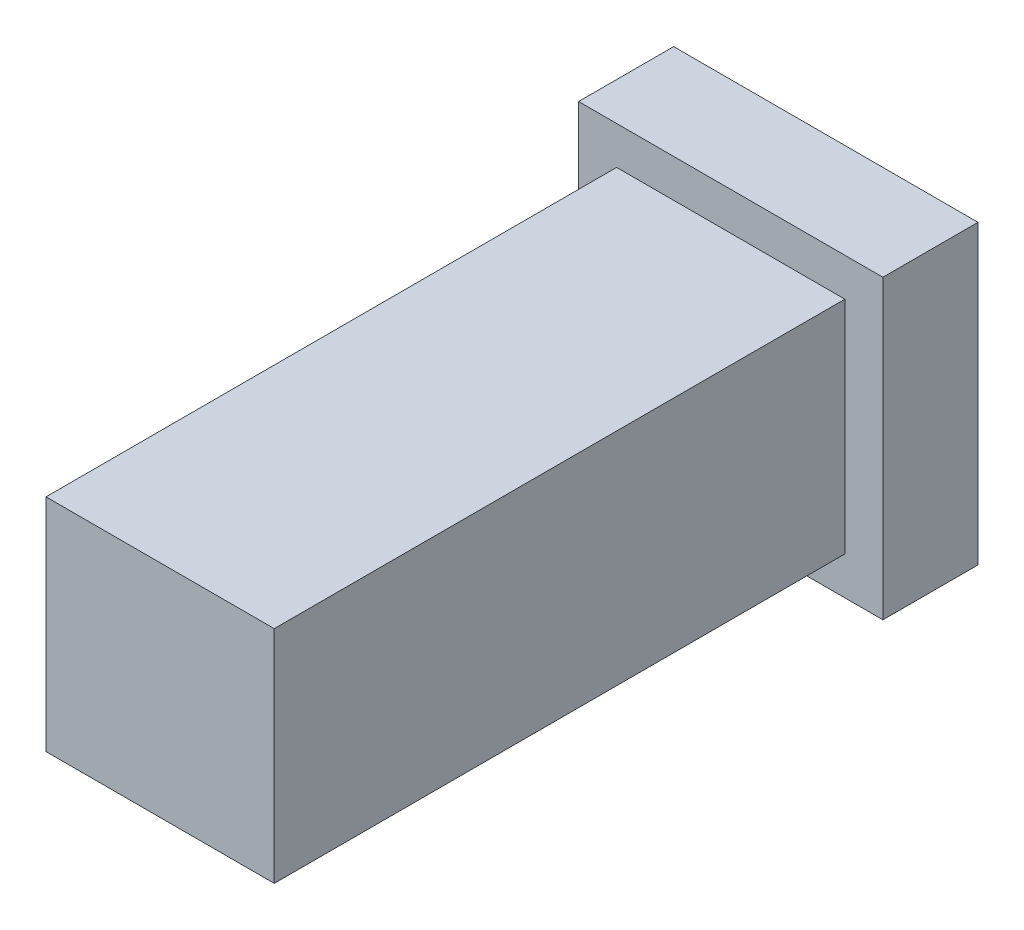
ISO-10303-21;
HEADER;
FILE_DESCRIPTION(('STEP AP214'),'2;1');
FILE_NAME('part.step','',(''),(''),'','','');
FILE_SCHEMA(('AUTOMOTIVE_DESIGN { 1 0 10303 214 1 1 1 1 }'));
ENDSEC;
DATA;
#1=APPLICATION_CONTEXT('core data for automotive mechanical design processes');
#2=APPLICATION_PROTOCOL_DEFINITION('international standard','automotive_design',2000,#1);
#3=PRODUCT_CONTEXT('',#1,'mechanical');
#4=PRODUCT('Part','Part','',(#3));
#5=PRODUCT_RELATED_PRODUCT_CATEGORY('part','',(#4));
#6=PRODUCT_DEFINITION_FORMATION('','',#4);
#7=PRODUCT_DEFINITION_CONTEXT('part definition',#1,'design');
#8=PRODUCT_DEFINITION('design','',#6,#7);
#9=PRODUCT_DEFINITION_SHAPE('','',#8);
#10=(LENGTH_UNIT() NAMED_UNIT(*) SI_UNIT(.MILLI.,.METRE.));
#11=(NAMED_UNIT(*) PLANE_ANGLE_UNIT() SI_UNIT($,.RADIAN.));
#12=(NAMED_UNIT(*) SI_UNIT($,.STERADIAN.) SOLID_ANGLE_UNIT());
#13=UNCERTAINTY_MEASURE_WITH_UNIT(LENGTH_MEASURE(1.E-05),#10,'distance_accuracy_value','');
#14=(GEOMETRIC_REPRESENTATION_CONTEXT(3) GLOBAL_UNCERTAINTY_ASSIGNED_CONTEXT((#13)) GLOBAL_UNIT_ASSIGNED_CONTEXT((#10,
#11,#12)) REPRESENTATION_CONTEXT('',''));
#15=CARTESIAN_POINT('',(0.,0.,0.));
#16=DIRECTION('',(0.,0.,1.));
#17=DIRECTION('',(1.,0.,0.));
#18=AXIS2_PLACEMENT_3D('',#15,#16,#17);
#19=CARTESIAN_POINT('',(3.,2.9,15.));
#20=DIRECTION('',(-1.,0.,0.));
#21=DIRECTION('',(0.,-1.,0.));
#22=AXIS2_PLACEMENT_3D('',#19,#20,#21);
#23=PLANE('',#22);
#24=DIRECTION('',(0.,1.,0.));
#25=VECTOR('',#24,1.);
#26=CARTESIAN_POINT('',(3.,2.9,0.));
#27=LINE('',#26,#25);
#28=CARTESIAN_POINT('',(3.,-2.9,0.));
#29=VERTEX_POINT('',#28);
#30=CARTESIAN_POINT('',(3.,2.9,0.));
#31=VERTEX_POINT('',#30);
#32=EDGE_CURVE('E131',#29,#31,#27,.T.);
#33=ORIENTED_EDGE('',*,*,#32,.T.);
#34=DIRECTION('',(0.,0.,-1.));
#35=VECTOR('',#34,1.);
#36=CARTESIAN_POINT('',(3.,2.9,15.));
#37=LINE('',#36,#35);
#38=CARTESIAN_POINT('',(3.,2.9,15.));
#39=VERTEX_POINT('',#38);
#40=EDGE_CURVE('E11',#39,#31,#37,.T.);
#41=ORIENTED_EDGE('',*,*,#40,.F.);
#42=DIRECTION('',(0.,1.,0.));
#43=VECTOR('',#42,1.);
#44=CARTESIAN_POINT('',(3.,2.9,15.));
#45=LINE('',#44,#43);
#46=CARTESIAN_POINT('',(3.,-2.9,15.));
#47=VERTEX_POINT('',#46);
#48=EDGE_CURVE('E140',#47,#39,#45,.T.);
#49=ORIENTED_EDGE('',*,*,#48,.F.);
#50=DIRECTION('',(0.,0.,-1.));
#51=VECTOR('',#50,1.);
#52=CARTESIAN_POINT('',(3.,-2.9,15.));
#53=LINE('',#52,#51);
#54=EDGE_CURVE('E149',#47,#29,#53,.T.);
#55=ORIENTED_EDGE('',*,*,#54,.T.);
#56=EDGE_LOOP('',(#33,#41,#49,#55));
#57=FACE_BOUND('',#56,.T.);
#58=ADVANCED_FACE('F45',(#57),#23,.F.);
#59=CARTESIAN_POINT('',(-3.,2.9,15.));
#60=DIRECTION('',(0.,-1.,0.));
#61=DIRECTION('',(0.,0.,-1.));
#62=AXIS2_PLACEMENT_3D('',#59,#60,#61);
#63=PLANE('',#62);
#64=DIRECTION('',(-1.,0.,0.));
#65=VECTOR('',#64,1.);
#66=CARTESIAN_POINT('',(-3.,2.9,0.));
#67=LINE('',#66,#65);
#68=CARTESIAN_POINT('',(-3.,2.9,0.));
#69=VERTEX_POINT('',#68);
#70=EDGE_CURVE('E134',#31,#69,#67,.T.);
#71=ORIENTED_EDGE('',*,*,#70,.T.);
#72=DIRECTION('',(0.,0.,-1.));
#73=VECTOR('',#72,1.);
#74=CARTESIAN_POINT('',(-3.,2.9,15.));
#75=LINE('',#74,#73);
#76=CARTESIAN_POINT('',(-3.,2.9,15.));
#77=VERTEX_POINT('',#76);
#78=EDGE_CURVE('E53',#77,#69,#75,.T.);
#79=ORIENTED_EDGE('',*,*,#78,.F.);
#80=DIRECTION('',(-1.,0.,0.));
#81=VECTOR('',#80,1.);
#82=CARTESIAN_POINT('',(-3.,2.9,15.));
#83=LINE('',#82,#81);
#84=EDGE_CURVE('E142',#39,#77,#83,.T.);
#85=ORIENTED_EDGE('',*,*,#84,.F.);
#86=ORIENTED_EDGE('',*,*,#40,.T.);
#87=EDGE_LOOP('',(#71,#79,#85,#86));
#88=FACE_BOUND('',#87,.T.);
#89=ADVANCED_FACE('F171',(#88),#63,.F.);
#90=CARTESIAN_POINT('',(-3.,2.9,15.));
#91=DIRECTION('',(1.,0.,0.));
#92=DIRECTION('',(0.,1.,0.));
#93=AXIS2_PLACEMENT_3D('',#90,#91,#92);
#94=PLANE('',#93);
#95=DIRECTION('',(0.,-1.,0.));
#96=VECTOR('',#95,1.);
#97=CARTESIAN_POINT('',(-3.,2.9,0.));
#98=LINE('',#97,#96);
#99=CARTESIAN_POINT('',(-3.,-2.9,0.));
#100=VERTEX_POINT('',#99);
#101=EDGE_CURVE('E153',#69,#100,#98,.T.);
#102=ORIENTED_EDGE('',*,*,#101,.T.);
#103=DIRECTION('',(0.,0.,-1.));
#104=VECTOR('',#103,1.);
#105=CARTESIAN_POINT('',(-3.,-2.9,15.));
#106=LINE('',#105,#104);
#107=CARTESIAN_POINT('',(-3.,-2.9,15.));
#108=VERTEX_POINT('',#107);
#109=EDGE_CURVE('E160',#108,#100,#106,.T.);
#110=ORIENTED_EDGE('',*,*,#109,.F.);
#111=DIRECTION('',(0.,-1.,0.));
#112=VECTOR('',#111,1.);
#113=CARTESIAN_POINT('',(-3.,2.9,15.));
#114=LINE('',#113,#112);
#115=EDGE_CURVE('E145',#77,#108,#114,.T.);
#116=ORIENTED_EDGE('',*,*,#115,.F.);
#117=ORIENTED_EDGE('',*,*,#78,.T.);
#118=EDGE_LOOP('',(#102,#110,#116,#117));
#119=FACE_BOUND('',#118,.T.);
#120=ADVANCED_FACE('F167',(#119),#94,.F.);
#121=CARTESIAN_POINT('',(-3.,-2.9,15.));
#122=DIRECTION('',(0.,1.,0.));
#123=DIRECTION('',(0.,0.,1.));
#124=AXIS2_PLACEMENT_3D('',#121,#122,#123);
#125=PLANE('',#124);
#126=DIRECTION('',(1.,0.,0.));
#127=VECTOR('',#126,1.);
#128=CARTESIAN_POINT('',(-3.,-2.9,0.));
#129=LINE('',#128,#127);
#130=EDGE_CURVE('E143',#100,#29,#129,.T.);
#131=ORIENTED_EDGE('',*,*,#130,.T.);
#132=ORIENTED_EDGE('',*,*,#54,.F.);
#133=DIRECTION('',(1.,0.,0.));
#134=VECTOR('',#133,1.);
#135=CARTESIAN_POINT('',(-3.,-2.9,15.));
#136=LINE('',#135,#134);
#137=EDGE_CURVE('E60',#108,#47,#136,.T.);
#138=ORIENTED_EDGE('',*,*,#137,.F.);
#139=ORIENTED_EDGE('',*,*,#109,.T.);
#140=EDGE_LOOP('',(#131,#132,#138,#139));
#141=FACE_BOUND('',#140,.T.);
#142=ADVANCED_FACE('F177',(#141),#125,.F.);
#143=CARTESIAN_POINT('',(0.,0.,15.));
#144=DIRECTION('',(0.,0.,1.));
#145=DIRECTION('',(1.,0.,0.));
#146=AXIS2_PLACEMENT_3D('',#143,#144,#145);
#147=PLANE('',#146);
#148=ORIENTED_EDGE('',*,*,#48,.T.);
#149=ORIENTED_EDGE('',*,*,#84,.T.);
#150=ORIENTED_EDGE('',*,*,#115,.T.);
#151=ORIENTED_EDGE('',*,*,#137,.T.);
#152=EDGE_LOOP('',(#148,#149,#150,#151));
#153=FACE_BOUND('',#152,.T.);
#154=ADVANCED_FACE('F180',(#153),#147,.T.);
#155=CARTESIAN_POINT('',(-4.,3.9,-2.5));
#156=DIRECTION('',(0.,-1.,0.));
#157=DIRECTION('',(0.,0.,-1.));
#158=AXIS2_PLACEMENT_3D('',#155,#156,#157);
#159=PLANE('',#158);
#160=DIRECTION('',(1.,0.,0.));
#161=VECTOR('',#160,1.);
#162=CARTESIAN_POINT('',(-4.,3.9,0.));
#163=LINE('',#162,#161);
#164=CARTESIAN_POINT('',(-4.,3.9,0.));
#165=VERTEX_POINT('',#164);
#166=CARTESIAN_POINT('',(4.,3.9,0.));
#167=VERTEX_POINT('',#166);
#168=EDGE_CURVE('E130',#165,#167,#163,.T.);
#169=ORIENTED_EDGE('',*,*,#168,.T.);
#170=DIRECTION('',(0.,0.,1.));
#171=VECTOR('',#170,1.);
#172=CARTESIAN_POINT('',(4.,3.9,-2.5));
#173=LINE('',#172,#171);
#174=CARTESIAN_POINT('',(4.,3.9,-2.5));
#175=VERTEX_POINT('',#174);
#176=EDGE_CURVE('E110',#175,#167,#173,.T.);
#177=ORIENTED_EDGE('',*,*,#176,.F.);
#178=DIRECTION('',(1.,0.,0.));
#179=VECTOR('',#178,1.);
#180=CARTESIAN_POINT('',(-4.,3.9,-2.5));
#181=LINE('',#180,#179);
#182=CARTESIAN_POINT('',(-4.,3.9,-2.5));
#183=VERTEX_POINT('',#182);
#184=EDGE_CURVE('E117',#183,#175,#181,.T.);
#185=ORIENTED_EDGE('',*,*,#184,.F.);
#186=DIRECTION('',(0.,0.,1.));
#187=VECTOR('',#186,1.);
#188=CARTESIAN_POINT('',(-4.,3.9,-2.5));
#189=LINE('',#188,#187);
#190=EDGE_CURVE('E275',#183,#165,#189,.T.);
#191=ORIENTED_EDGE('',*,*,#190,.T.);
#192=EDGE_LOOP('',(#169,#177,#185,#191));
#193=FACE_BOUND('',#192,.T.);
#194=ADVANCED_FACE('F128',(#193),#159,.F.);
#195=CARTESIAN_POINT('',(4.,3.9,-2.5));
#196=DIRECTION('',(-1.,0.,0.));
#197=DIRECTION('',(0.,-1.,0.));
#198=AXIS2_PLACEMENT_3D('',#195,#196,#197);
#199=PLANE('',#198);
#200=DIRECTION('',(0.,-1.,0.));
#201=VECTOR('',#200,1.);
#202=CARTESIAN_POINT('',(4.,3.9,0.));
#203=LINE('',#202,#201);
#204=CARTESIAN_POINT('',(4.,-3.9,0.));
#205=VERTEX_POINT('',#204);
#206=EDGE_CURVE('E281',#167,#205,#203,.T.);
#207=ORIENTED_EDGE('',*,*,#206,.T.);
#208=DIRECTION('',(0.,0.,1.));
#209=VECTOR('',#208,1.);
#210=CARTESIAN_POINT('',(4.,-3.9,-2.5));
#211=LINE('',#210,#209);
#212=CARTESIAN_POINT('',(4.,-3.9,-2.5));
#213=VERTEX_POINT('',#212);
#214=EDGE_CURVE('E113',#213,#205,#211,.T.);
#215=ORIENTED_EDGE('',*,*,#214,.F.);
#216=DIRECTION('',(0.,-1.,0.));
#217=VECTOR('',#216,1.);
#218=CARTESIAN_POINT('',(4.,3.9,-2.5));
#219=LINE('',#218,#217);
#220=EDGE_CURVE('E106',#175,#213,#219,.T.);
#221=ORIENTED_EDGE('',*,*,#220,.F.);
#222=ORIENTED_EDGE('',*,*,#176,.T.);
#223=EDGE_LOOP('',(#207,#215,#221,#222));
#224=FACE_BOUND('',#223,.T.);
#225=ADVANCED_FACE('F108',(#224),#199,.F.);
#226=CARTESIAN_POINT('',(4.,-3.9,-2.5));
#227=DIRECTION('',(0.,1.,0.));
#228=DIRECTION('',(0.,0.,1.));
#229=AXIS2_PLACEMENT_3D('',#226,#227,#228);
#230=PLANE('',#229);
#231=DIRECTION('',(-1.,0.,0.));
#232=VECTOR('',#231,1.);
#233=CARTESIAN_POINT('',(4.,-3.9,0.));
#234=LINE('',#233,#232);
#235=CARTESIAN_POINT('',(-4.,-3.9,0.));
#236=VERTEX_POINT('',#235);
#237=EDGE_CURVE('E278',#205,#236,#234,.T.);
#238=ORIENTED_EDGE('',*,*,#237,.T.);
#239=DIRECTION('',(0.,0.,1.));
#240=VECTOR('',#239,1.);
#241=CARTESIAN_POINT('',(-4.,-3.9,-2.5));
#242=LINE('',#241,#240);
#243=CARTESIAN_POINT('',(-4.,-3.9,-2.5));
#244=VERTEX_POINT('',#243);
#245=EDGE_CURVE('E136',#244,#236,#242,.T.);
#246=ORIENTED_EDGE('',*,*,#245,.F.);
#247=DIRECTION('',(-1.,0.,0.));
#248=VECTOR('',#247,1.);
#249=CARTESIAN_POINT('',(4.,-3.9,-2.5));
#250=LINE('',#249,#248);
#251=EDGE_CURVE('E116',#213,#244,#250,.T.);
#252=ORIENTED_EDGE('',*,*,#251,.F.);
#253=ORIENTED_EDGE('',*,*,#214,.T.);
#254=EDGE_LOOP('',(#238,#246,#252,#253));
#255=FACE_BOUND('',#254,.T.);
#256=ADVANCED_FACE('F217',(#255),#230,.F.);
#257=CARTESIAN_POINT('',(-4.,-3.9,-2.5));
#258=DIRECTION('',(1.,0.,0.));
#259=DIRECTION('',(0.,1.,0.));
#260=AXIS2_PLACEMENT_3D('',#257,#258,#259);
#261=PLANE('',#260);
#262=DIRECTION('',(0.,1.,0.));
#263=VECTOR('',#262,1.);
#264=CARTESIAN_POINT('',(-4.,-3.9,0.));
#265=LINE('',#264,#263);
#266=EDGE_CURVE('E126',#236,#165,#265,.T.);
#267=ORIENTED_EDGE('',*,*,#266,.T.);
#268=ORIENTED_EDGE('',*,*,#190,.F.);
#269=DIRECTION('',(0.,1.,0.));
#270=VECTOR('',#269,1.);
#271=CARTESIAN_POINT('',(-4.,-3.9,-2.5));
#272=LINE('',#271,#270);
#273=EDGE_CURVE('E122',#244,#183,#272,.T.);
#274=ORIENTED_EDGE('',*,*,#273,.F.);
#275=ORIENTED_EDGE('',*,*,#245,.T.);
#276=EDGE_LOOP('',(#267,#268,#274,#275));
#277=FACE_BOUND('',#276,.T.);
#278=ADVANCED_FACE('F225',(#277),#261,.F.);
#279=CARTESIAN_POINT('',(0.,0.,-2.5));
#280=DIRECTION('',(0.,0.,-1.));
#281=DIRECTION('',(-1.,0.,0.));
#282=AXIS2_PLACEMENT_3D('',#279,#280,#281);
#283=PLANE('',#282);
#284=ORIENTED_EDGE('',*,*,#184,.T.);
#285=ORIENTED_EDGE('',*,*,#220,.T.);
#286=ORIENTED_EDGE('',*,*,#251,.T.);
#287=ORIENTED_EDGE('',*,*,#273,.T.);
#288=EDGE_LOOP('',(#284,#285,#286,#287));
#289=FACE_BOUND('',#288,.T.);
#290=ADVANCED_FACE('F120',(#289),#283,.T.);
#291=CARTESIAN_POINT('',(0.,0.,0.));
#292=DIRECTION('',(0.,0.,-1.));
#293=DIRECTION('',(-1.,0.,0.));
#294=AXIS2_PLACEMENT_3D('',#291,#292,#293);
#295=PLANE('',#294);
#296=ORIENTED_EDGE('',*,*,#32,.F.);
#297=ORIENTED_EDGE('',*,*,#130,.F.);
#298=ORIENTED_EDGE('',*,*,#101,.F.);
#299=ORIENTED_EDGE('',*,*,#70,.F.);
#300=EDGE_LOOP('',(#296,#297,#298,#299));
#301=FACE_BOUND('',#300,.T.);
#302=ORIENTED_EDGE('',*,*,#168,.F.);
#303=ORIENTED_EDGE('',*,*,#266,.F.);
#304=ORIENTED_EDGE('',*,*,#237,.F.);
#305=ORIENTED_EDGE('',*,*,#206,.F.);
#306=EDGE_LOOP('',(#302,#303,#304,#305));
#307=FACE_BOUND('',#306,.T.);
#308=ADVANCED_FACE('F174',(#301,#307),#295,.F.);
#309=CLOSED_SHELL('',(#58,#89,#120,#142,#154,#194,#225,#256,#278,#290,#308));
#310=MANIFOLD_SOLID_BREP('B2',#309);
#311=ADVANCED_BREP_SHAPE_REPRESENTATION('',(#18,#310),#14);
#312=SHAPE_DEFINITION_REPRESENTATION(#9,#311);
ENDSEC;
END-ISO-10303-21;
